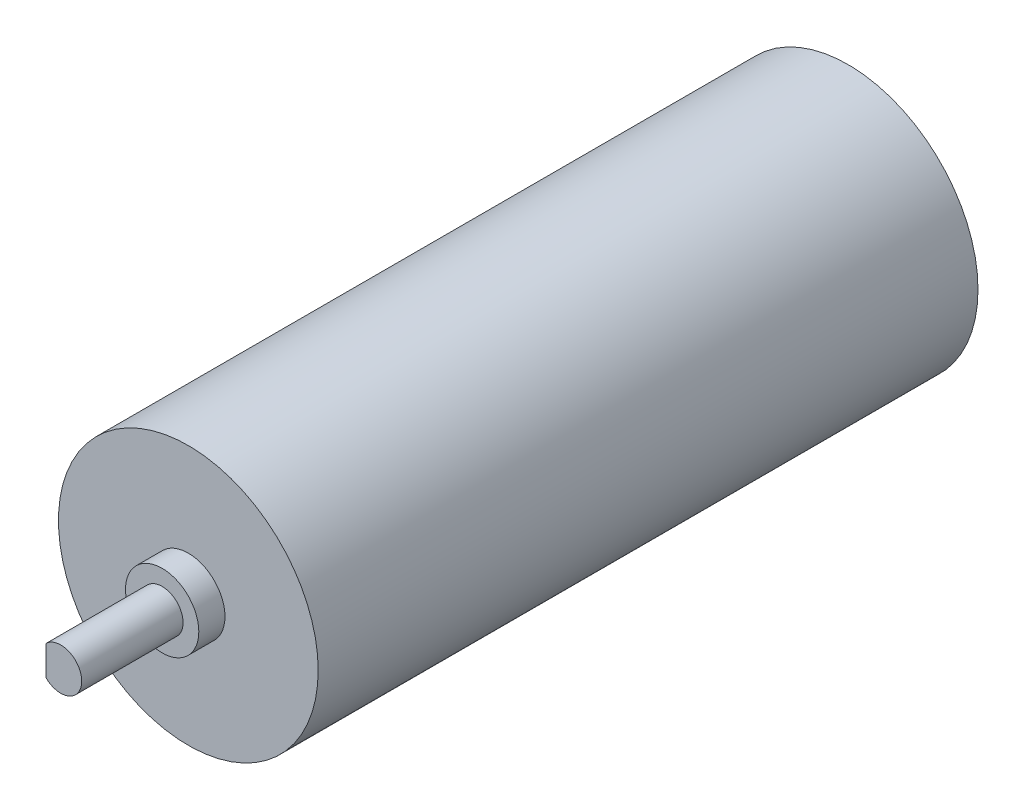
ISO-10303-21;
HEADER;
FILE_DESCRIPTION(('STEP AP214'),'2;1');
FILE_NAME('part.step','',(''),(''),'','','');
FILE_SCHEMA(('AUTOMOTIVE_DESIGN { 1 0 10303 214 1 1 1 1 }'));
ENDSEC;
DATA;
#1=APPLICATION_CONTEXT('core data for automotive mechanical design processes');
#2=APPLICATION_PROTOCOL_DEFINITION('international standard','automotive_design',2000,#1);
#3=PRODUCT_CONTEXT('',#1,'mechanical');
#4=PRODUCT('Part','Part','',(#3));
#5=PRODUCT_RELATED_PRODUCT_CATEGORY('part','',(#4));
#6=PRODUCT_DEFINITION_FORMATION('','',#4);
#7=PRODUCT_DEFINITION_CONTEXT('part definition',#1,'design');
#8=PRODUCT_DEFINITION('design','',#6,#7);
#9=PRODUCT_DEFINITION_SHAPE('','',#8);
#10=(LENGTH_UNIT() NAMED_UNIT(*) SI_UNIT(.MILLI.,.METRE.));
#11=(NAMED_UNIT(*) PLANE_ANGLE_UNIT() SI_UNIT($,.RADIAN.));
#12=(NAMED_UNIT(*) SI_UNIT($,.STERADIAN.) SOLID_ANGLE_UNIT());
#13=UNCERTAINTY_MEASURE_WITH_UNIT(LENGTH_MEASURE(1.E-05),#10,'distance_accuracy_value','');
#14=(GEOMETRIC_REPRESENTATION_CONTEXT(3) GLOBAL_UNCERTAINTY_ASSIGNED_CONTEXT((#13)) GLOBAL_UNIT_ASSIGNED_CONTEXT((#10,
#11,#12)) REPRESENTATION_CONTEXT('',''));
#15=CARTESIAN_POINT('',(0.,0.,0.));
#16=DIRECTION('',(0.,0.,1.));
#17=DIRECTION('',(1.,0.,0.));
#18=AXIS2_PLACEMENT_3D('',#15,#16,#17);
#19=CARTESIAN_POINT('',(0.,0.,65.5));
#20=DIRECTION('',(0.,0.,1.));
#21=DIRECTION('',(1.,0.,0.));
#22=AXIS2_PLACEMENT_3D('',#19,#20,#21);
#23=PLANE('',#22);
#24=CARTESIAN_POINT('',(0.,0.,65.5));
#25=DIRECTION('',(0.,0.,1.));
#26=DIRECTION('',(1.,0.,0.));
#27=AXIS2_PLACEMENT_3D('',#24,#25,#26);
#28=CIRCLE('',#27,3.5);
#29=CARTESIAN_POINT('',(3.5,0.,65.5));
#30=VERTEX_POINT('',#29);
#31=EDGE_CURVE('E90',#30,#30,#28,.T.);
#32=ORIENTED_EDGE('',*,*,#31,.T.);
#33=EDGE_LOOP('',(#32));
#34=FACE_BOUND('',#33,.T.);
#35=DIRECTION('',(0.,-1.,0.));
#36=VECTOR('',#35,1.);
#37=CARTESIAN_POINT('',(-1.41,1.4184146079338,65.5));
#38=LINE('',#37,#36);
#39=CARTESIAN_POINT('',(-1.41,1.4184146079338,65.5));
#40=VERTEX_POINT('',#39);
#41=CARTESIAN_POINT('',(-1.41,-1.4184146079338,65.5));
#42=VERTEX_POINT('',#41);
#43=EDGE_CURVE('E70',#40,#42,#38,.T.);
#44=ORIENTED_EDGE('',*,*,#43,.F.);
#45=CARTESIAN_POINT('',(0.,0.,65.5));
#46=DIRECTION('',(0.,0.,1.));
#47=DIRECTION('',(1.,0.,0.));
#48=AXIS2_PLACEMENT_3D('',#45,#46,#47);
#49=CIRCLE('',#48,2.);
#50=EDGE_CURVE('E55',#42,#40,#49,.T.);
#51=ORIENTED_EDGE('',*,*,#50,.F.);
#52=EDGE_LOOP('',(#44,#51));
#53=FACE_BOUND('',#52,.T.);
#54=ADVANCED_FACE('F39',(#34,#53),#23,.T.);
#55=CARTESIAN_POINT('',(0.,0.,63.));
#56=DIRECTION('',(0.,0.,-1.));
#57=DIRECTION('',(-1.,0.,0.));
#58=AXIS2_PLACEMENT_3D('',#55,#56,#57);
#59=CYLINDRICAL_SURFACE('',#58,12.4);
#60=CARTESIAN_POINT('',(0.,0.,63.));
#61=DIRECTION('',(0.,0.,1.));
#62=DIRECTION('',(1.,0.,0.));
#63=AXIS2_PLACEMENT_3D('',#60,#61,#62);
#64=CIRCLE('',#63,12.4);
#65=CARTESIAN_POINT('',(12.4,0.,63.));
#66=VERTEX_POINT('',#65);
#67=EDGE_CURVE('E11',#66,#66,#64,.T.);
#68=ORIENTED_EDGE('',*,*,#67,.F.);
#69=EDGE_LOOP('',(#68));
#70=FACE_BOUND('',#69,.T.);
#71=CARTESIAN_POINT('',(0.,0.,0.));
#72=DIRECTION('',(0.,0.,1.));
#73=DIRECTION('',(1.,0.,0.));
#74=AXIS2_PLACEMENT_3D('',#71,#72,#73);
#75=CIRCLE('',#74,12.4);
#76=CARTESIAN_POINT('',(12.4,0.,0.));
#77=VERTEX_POINT('',#76);
#78=EDGE_CURVE('E43',#77,#77,#75,.T.);
#79=ORIENTED_EDGE('',*,*,#78,.T.);
#80=EDGE_LOOP('',(#79));
#81=FACE_BOUND('',#80,.T.);
#82=ADVANCED_FACE('F41',(#70,#81),#59,.T.);
#83=CARTESIAN_POINT('',(0.,0.,63.));
#84=DIRECTION('',(0.,0.,1.));
#85=DIRECTION('',(1.,0.,0.));
#86=AXIS2_PLACEMENT_3D('',#83,#84,#85);
#87=PLANE('',#86);
#88=CARTESIAN_POINT('',(0.,0.,63.));
#89=DIRECTION('',(0.,0.,1.));
#90=DIRECTION('',(1.,0.,0.));
#91=AXIS2_PLACEMENT_3D('',#88,#89,#90);
#92=CIRCLE('',#91,3.5);
#93=CARTESIAN_POINT('',(3.5,0.,63.));
#94=VERTEX_POINT('',#93);
#95=EDGE_CURVE('E89',#94,#94,#92,.T.);
#96=ORIENTED_EDGE('',*,*,#95,.F.);
#97=EDGE_LOOP('',(#96));
#98=FACE_BOUND('',#97,.T.);
#99=ORIENTED_EDGE('',*,*,#67,.T.);
#100=EDGE_LOOP('',(#99));
#101=FACE_BOUND('',#100,.T.);
#102=ADVANCED_FACE('F100',(#98,#101),#87,.T.);
#103=CARTESIAN_POINT('',(0.,0.,0.));
#104=DIRECTION('',(0.,0.,1.));
#105=DIRECTION('',(1.,0.,0.));
#106=AXIS2_PLACEMENT_3D('',#103,#104,#105);
#107=PLANE('',#106);
#108=ORIENTED_EDGE('',*,*,#78,.F.);
#109=EDGE_LOOP('',(#108));
#110=FACE_BOUND('',#109,.T.);
#111=ADVANCED_FACE('F103',(#110),#107,.F.);
#112=CARTESIAN_POINT('',(0.,0.,65.5));
#113=DIRECTION('',(0.,0.,-1.));
#114=DIRECTION('',(-1.,0.,0.));
#115=AXIS2_PLACEMENT_3D('',#112,#113,#114);
#116=CYLINDRICAL_SURFACE('',#115,3.5);
#117=ORIENTED_EDGE('',*,*,#31,.F.);
#118=EDGE_LOOP('',(#117));
#119=FACE_BOUND('',#118,.T.);
#120=ORIENTED_EDGE('',*,*,#95,.T.);
#121=EDGE_LOOP('',(#120));
#122=FACE_BOUND('',#121,.T.);
#123=ADVANCED_FACE('F98',(#119,#122),#116,.T.);
#124=CARTESIAN_POINT('',(0.,0.,75.18));
#125=DIRECTION('',(0.,0.,-1.));
#126=DIRECTION('',(-1.,0.,0.));
#127=AXIS2_PLACEMENT_3D('',#124,#125,#126);
#128=CYLINDRICAL_SURFACE('',#127,2.);
#129=ORIENTED_EDGE('',*,*,#50,.T.);
#130=DIRECTION('',(0.,0.,-1.));
#131=VECTOR('',#130,1.);
#132=CARTESIAN_POINT('',(-1.41,1.4184146079338,75.18));
#133=LINE('',#132,#131);
#134=CARTESIAN_POINT('',(-1.41,1.4184146079338,75.18));
#135=VERTEX_POINT('',#134);
#136=EDGE_CURVE('E74',#135,#40,#133,.T.);
#137=ORIENTED_EDGE('',*,*,#136,.F.);
#138=CARTESIAN_POINT('',(0.,0.,75.18));
#139=DIRECTION('',(0.,0.,1.));
#140=DIRECTION('',(1.,0.,0.));
#141=AXIS2_PLACEMENT_3D('',#138,#139,#140);
#142=CIRCLE('',#141,2.);
#143=CARTESIAN_POINT('',(-1.41,-1.4184146079338,75.18));
#144=VERTEX_POINT('',#143);
#145=EDGE_CURVE('E77',#144,#135,#142,.T.);
#146=ORIENTED_EDGE('',*,*,#145,.F.);
#147=DIRECTION('',(0.,0.,-1.));
#148=VECTOR('',#147,1.);
#149=CARTESIAN_POINT('',(-1.41,-1.4184146079338,75.18));
#150=LINE('',#149,#148);
#151=EDGE_CURVE('E72',#144,#42,#150,.T.);
#152=ORIENTED_EDGE('',*,*,#151,.T.);
#153=EDGE_LOOP('',(#129,#137,#146,#152));
#154=FACE_BOUND('',#153,.T.);
#155=ADVANCED_FACE('F79',(#154),#128,.T.);
#156=CARTESIAN_POINT('',(-1.41,1.4184146079338,75.18));
#157=DIRECTION('',(1.,0.,0.));
#158=DIRECTION('',(0.,1.,0.));
#159=AXIS2_PLACEMENT_3D('',#156,#157,#158);
#160=PLANE('',#159);
#161=ORIENTED_EDGE('',*,*,#43,.T.);
#162=ORIENTED_EDGE('',*,*,#151,.F.);
#163=DIRECTION('',(0.,-1.,0.));
#164=VECTOR('',#163,1.);
#165=CARTESIAN_POINT('',(-1.41,1.4184146079338,75.18));
#166=LINE('',#165,#164);
#167=EDGE_CURVE('E63',#135,#144,#166,.T.);
#168=ORIENTED_EDGE('',*,*,#167,.F.);
#169=ORIENTED_EDGE('',*,*,#136,.T.);
#170=EDGE_LOOP('',(#161,#162,#168,#169));
#171=FACE_BOUND('',#170,.T.);
#172=ADVANCED_FACE('F71',(#171),#160,.F.);
#173=CARTESIAN_POINT('',(0.,0.,75.18));
#174=DIRECTION('',(0.,0.,1.));
#175=DIRECTION('',(1.,0.,0.));
#176=AXIS2_PLACEMENT_3D('',#173,#174,#175);
#177=PLANE('',#176);
#178=ORIENTED_EDGE('',*,*,#145,.T.);
#179=ORIENTED_EDGE('',*,*,#167,.T.);
#180=EDGE_LOOP('',(#178,#179));
#181=FACE_BOUND('',#180,.T.);
#182=ADVANCED_FACE('F129',(#181),#177,.T.);
#183=CLOSED_SHELL('',(#54,#82,#102,#111,#123,#155,#172,#182));
#184=MANIFOLD_SOLID_BREP('B2',#183);
#185=ADVANCED_BREP_SHAPE_REPRESENTATION('',(#18,#184),#14);
#186=SHAPE_DEFINITION_REPRESENTATION(#9,#185);
ENDSEC;
END-ISO-10303-21;
